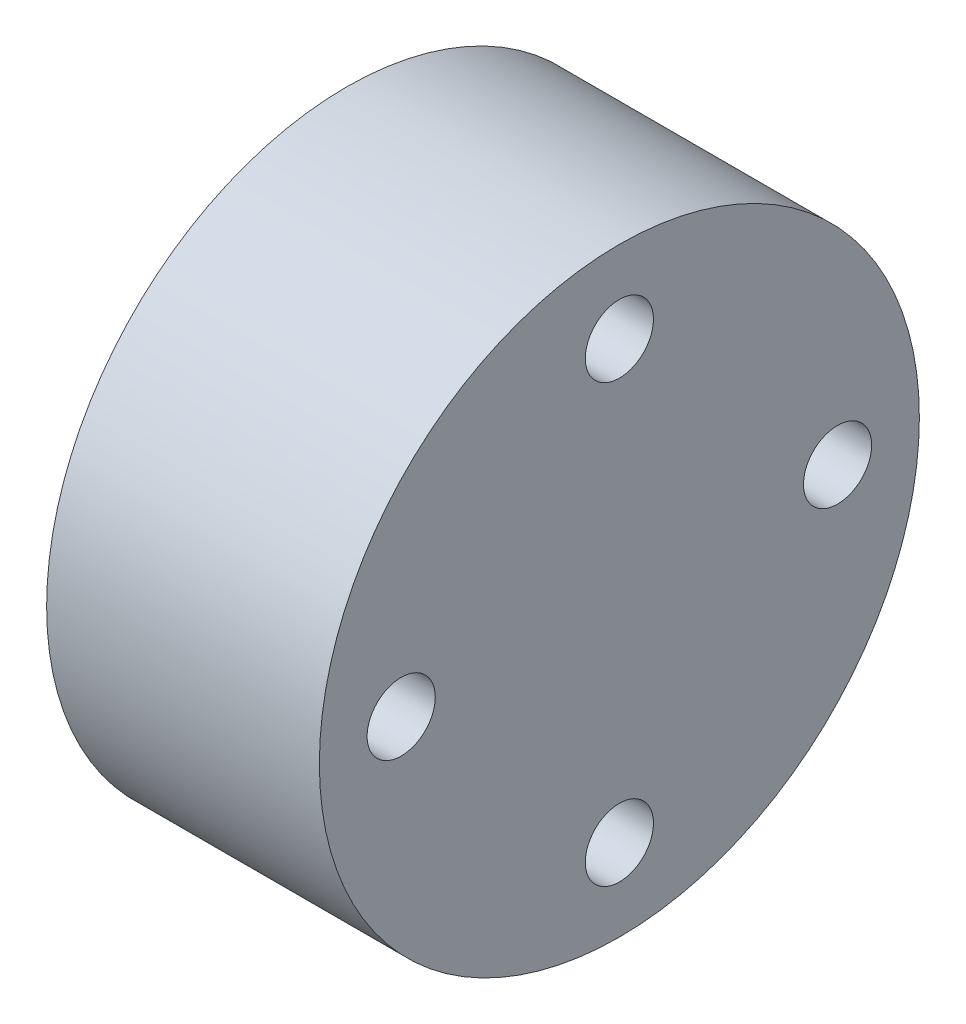
ISO-10303-21;
HEADER;
FILE_DESCRIPTION(('STEP AP214'),'2;1');
FILE_NAME('part.step','',(''),(''),'','','');
FILE_SCHEMA(('AUTOMOTIVE_DESIGN { 1 0 10303 214 1 1 1 1 }'));
ENDSEC;
DATA;
#1=APPLICATION_CONTEXT('core data for automotive mechanical design processes');
#2=APPLICATION_PROTOCOL_DEFINITION('international standard','automotive_design',2000,#1);
#3=PRODUCT_CONTEXT('',#1,'mechanical');
#4=PRODUCT('Part','Part','',(#3));
#5=PRODUCT_RELATED_PRODUCT_CATEGORY('part','',(#4));
#6=PRODUCT_DEFINITION_FORMATION('','',#4);
#7=PRODUCT_DEFINITION_CONTEXT('part definition',#1,'design');
#8=PRODUCT_DEFINITION('design','',#6,#7);
#9=PRODUCT_DEFINITION_SHAPE('','',#8);
#10=(LENGTH_UNIT() NAMED_UNIT(*) SI_UNIT(.MILLI.,.METRE.));
#11=(NAMED_UNIT(*) PLANE_ANGLE_UNIT() SI_UNIT($,.RADIAN.));
#12=(NAMED_UNIT(*) SI_UNIT($,.STERADIAN.) SOLID_ANGLE_UNIT());
#13=UNCERTAINTY_MEASURE_WITH_UNIT(LENGTH_MEASURE(1.E-05),#10,'distance_accuracy_value','');
#14=(GEOMETRIC_REPRESENTATION_CONTEXT(3) GLOBAL_UNCERTAINTY_ASSIGNED_CONTEXT((#13)) GLOBAL_UNIT_ASSIGNED_CONTEXT((#10,
#11,#12)) REPRESENTATION_CONTEXT('',''));
#15=CARTESIAN_POINT('',(0.,0.,0.));
#16=DIRECTION('',(0.,0.,1.));
#17=DIRECTION('',(1.,0.,0.));
#18=AXIS2_PLACEMENT_3D('',#15,#16,#17);
#19=CARTESIAN_POINT('',(10.,0.,0.));
#20=DIRECTION('',(-1.,0.,0.));
#21=DIRECTION('',(0.,0.,-1.));
#22=AXIS2_PLACEMENT_3D('',#19,#20,#21);
#23=CYLINDRICAL_SURFACE('',#22,11.);
#24=CARTESIAN_POINT('',(10.,0.,0.));
#25=DIRECTION('',(-1.,0.,0.));
#26=DIRECTION('',(0.,0.,1.));
#27=AXIS2_PLACEMENT_3D('',#24,#25,#26);
#28=CIRCLE('',#27,11.);
#29=CARTESIAN_POINT('',(10.,0.,11.));
#30=VERTEX_POINT('',#29);
#31=EDGE_CURVE('E10',#30,#30,#28,.T.);
#32=ORIENTED_EDGE('',*,*,#31,.T.);
#33=EDGE_LOOP('',(#32));
#34=FACE_BOUND('',#33,.T.);
#35=CARTESIAN_POINT('',(0.,0.,0.));
#36=DIRECTION('',(-1.,0.,0.));
#37=DIRECTION('',(0.,0.,1.));
#38=AXIS2_PLACEMENT_3D('',#35,#36,#37);
#39=CIRCLE('',#38,11.);
#40=CARTESIAN_POINT('',(0.,0.,11.));
#41=VERTEX_POINT('',#40);
#42=EDGE_CURVE('E38',#41,#41,#39,.T.);
#43=ORIENTED_EDGE('',*,*,#42,.F.);
#44=EDGE_LOOP('',(#43));
#45=FACE_BOUND('',#44,.T.);
#46=ADVANCED_FACE('F35',(#34,#45),#23,.T.);
#47=CARTESIAN_POINT('',(10.,0.,0.));
#48=DIRECTION('',(1.,0.,0.));
#49=DIRECTION('',(0.,0.,1.));
#50=AXIS2_PLACEMENT_3D('',#47,#48,#49);
#51=PLANE('',#50);
#52=CARTESIAN_POINT('',(10.,-4.54747350886464E-13,7.99999999999955));
#53=DIRECTION('',(1.,0.,0.));
#54=DIRECTION('',(0.,0.,-1.));
#55=AXIS2_PLACEMENT_3D('',#52,#53,#54);
#56=CIRCLE('',#55,1.25000000000065);
#57=CARTESIAN_POINT('',(10.,-4.54747350886464E-13,6.7499999999989));
#58=VERTEX_POINT('',#57);
#59=EDGE_CURVE('E62',#58,#58,#56,.T.);
#60=ORIENTED_EDGE('',*,*,#59,.F.);
#61=EDGE_LOOP('',(#60));
#62=FACE_BOUND('',#61,.T.);
#63=CARTESIAN_POINT('',(10.,-8.,-9.07535266894292E-13));
#64=DIRECTION('',(1.,0.,0.));
#65=DIRECTION('',(0.,0.,-1.));
#66=AXIS2_PLACEMENT_3D('',#63,#64,#65);
#67=CIRCLE('',#66,1.25000000000092);
#68=CARTESIAN_POINT('',(10.,-8.,-1.25000000000183));
#69=VERTEX_POINT('',#68);
#70=EDGE_CURVE('E56',#69,#69,#67,.T.);
#71=ORIENTED_EDGE('',*,*,#70,.F.);
#72=EDGE_LOOP('',(#71));
#73=FACE_BOUND('',#72,.T.);
#74=CARTESIAN_POINT('',(10.,4.53767633447146E-13,-8.00000000000045));
#75=DIRECTION('',(1.,0.,0.));
#76=DIRECTION('',(0.,0.,-1.));
#77=AXIS2_PLACEMENT_3D('',#74,#75,#76);
#78=CIRCLE('',#77,1.25000000000033);
#79=CARTESIAN_POINT('',(10.,4.53767633447146E-13,-9.25000000000078));
#80=VERTEX_POINT('',#79);
#81=EDGE_CURVE('E50',#80,#80,#78,.T.);
#82=ORIENTED_EDGE('',*,*,#81,.F.);
#83=EDGE_LOOP('',(#82));
#84=FACE_BOUND('',#83,.T.);
#85=CARTESIAN_POINT('',(10.,8.,0.));
#86=DIRECTION('',(1.,0.,0.));
#87=DIRECTION('',(0.,0.,-1.));
#88=AXIS2_PLACEMENT_3D('',#85,#86,#87);
#89=CIRCLE('',#88,1.25);
#90=CARTESIAN_POINT('',(10.,8.,-1.25));
#91=VERTEX_POINT('',#90);
#92=EDGE_CURVE('E45',#91,#91,#89,.T.);
#93=ORIENTED_EDGE('',*,*,#92,.F.);
#94=EDGE_LOOP('',(#93));
#95=FACE_BOUND('',#94,.T.);
#96=ORIENTED_EDGE('',*,*,#31,.F.);
#97=EDGE_LOOP('',(#96));
#98=FACE_BOUND('',#97,.T.);
#99=ADVANCED_FACE('F89',(#62,#73,#84,#95,#98),#51,.T.);
#100=CARTESIAN_POINT('',(0.,0.,0.));
#101=DIRECTION('',(1.,0.,0.));
#102=DIRECTION('',(0.,0.,1.));
#103=AXIS2_PLACEMENT_3D('',#100,#101,#102);
#104=PLANE('',#103);
#105=CARTESIAN_POINT('',(0.,0.,0.));
#106=DIRECTION('',(1.,0.,0.));
#107=DIRECTION('',(0.,0.,-1.));
#108=AXIS2_PLACEMENT_3D('',#105,#106,#107);
#109=CIRCLE('',#108,5.);
#110=CARTESIAN_POINT('',(0.,0.,-5.));
#111=VERTEX_POINT('',#110);
#112=EDGE_CURVE('E71',#111,#111,#109,.T.);
#113=ORIENTED_EDGE('',*,*,#112,.T.);
#114=EDGE_LOOP('',(#113));
#115=FACE_BOUND('',#114,.T.);
#116=CARTESIAN_POINT('',(0.,-4.54747350886464E-13,7.99999999999955));
#117=DIRECTION('',(1.,0.,0.));
#118=DIRECTION('',(0.,0.,-1.));
#119=AXIS2_PLACEMENT_3D('',#116,#117,#118);
#120=CIRCLE('',#119,1.25000000000065);
#121=CARTESIAN_POINT('',(0.,-4.54747350886464E-13,6.7499999999989));
#122=VERTEX_POINT('',#121);
#123=EDGE_CURVE('E65',#122,#122,#120,.T.);
#124=ORIENTED_EDGE('',*,*,#123,.T.);
#125=EDGE_LOOP('',(#124));
#126=FACE_BOUND('',#125,.T.);
#127=CARTESIAN_POINT('',(0.,-8.,-9.07535266894292E-13));
#128=DIRECTION('',(1.,0.,0.));
#129=DIRECTION('',(0.,0.,-1.));
#130=AXIS2_PLACEMENT_3D('',#127,#128,#129);
#131=CIRCLE('',#130,1.25000000000092);
#132=CARTESIAN_POINT('',(0.,-8.,-1.25000000000183));
#133=VERTEX_POINT('',#132);
#134=EDGE_CURVE('E59',#133,#133,#131,.T.);
#135=ORIENTED_EDGE('',*,*,#134,.T.);
#136=EDGE_LOOP('',(#135));
#137=FACE_BOUND('',#136,.T.);
#138=CARTESIAN_POINT('',(0.,4.53767633447146E-13,-8.00000000000045));
#139=DIRECTION('',(1.,0.,0.));
#140=DIRECTION('',(0.,0.,-1.));
#141=AXIS2_PLACEMENT_3D('',#138,#139,#140);
#142=CIRCLE('',#141,1.25000000000033);
#143=CARTESIAN_POINT('',(0.,4.53767633447146E-13,-9.25000000000078));
#144=VERTEX_POINT('',#143);
#145=EDGE_CURVE('E53',#144,#144,#142,.T.);
#146=ORIENTED_EDGE('',*,*,#145,.T.);
#147=EDGE_LOOP('',(#146));
#148=FACE_BOUND('',#147,.T.);
#149=CARTESIAN_POINT('',(0.,8.,0.));
#150=DIRECTION('',(1.,0.,0.));
#151=DIRECTION('',(0.,0.,-1.));
#152=AXIS2_PLACEMENT_3D('',#149,#150,#151);
#153=CIRCLE('',#152,1.25);
#154=CARTESIAN_POINT('',(0.,8.,-1.25));
#155=VERTEX_POINT('',#154);
#156=EDGE_CURVE('E47',#155,#155,#153,.T.);
#157=ORIENTED_EDGE('',*,*,#156,.T.);
#158=EDGE_LOOP('',(#157));
#159=FACE_BOUND('',#158,.T.);
#160=ORIENTED_EDGE('',*,*,#42,.T.);
#161=EDGE_LOOP('',(#160));
#162=FACE_BOUND('',#161,.T.);
#163=ADVANCED_FACE('F93',(#115,#126,#137,#148,#159,#162),#104,.F.);
#164=CARTESIAN_POINT('',(10.,8.,0.));
#165=DIRECTION('',(-1.,0.,0.));
#166=DIRECTION('',(0.,0.,-1.));
#167=AXIS2_PLACEMENT_3D('',#164,#165,#166);
#168=CYLINDRICAL_SURFACE('',#167,1.25);
#169=ORIENTED_EDGE('',*,*,#92,.T.);
#170=EDGE_LOOP('',(#169));
#171=FACE_BOUND('',#170,.T.);
#172=ORIENTED_EDGE('',*,*,#156,.F.);
#173=EDGE_LOOP('',(#172));
#174=FACE_BOUND('',#173,.T.);
#175=ADVANCED_FACE('F100',(#171,#174),#168,.F.);
#176=CARTESIAN_POINT('',(10.,4.53767633447146E-13,-8.00000000000045));
#177=DIRECTION('',(-1.,0.,0.));
#178=DIRECTION('',(0.,0.,-1.));
#179=AXIS2_PLACEMENT_3D('',#176,#177,#178);
#180=CYLINDRICAL_SURFACE('',#179,1.25000000000033);
#181=ORIENTED_EDGE('',*,*,#81,.T.);
#182=EDGE_LOOP('',(#181));
#183=FACE_BOUND('',#182,.T.);
#184=ORIENTED_EDGE('',*,*,#145,.F.);
#185=EDGE_LOOP('',(#184));
#186=FACE_BOUND('',#185,.T.);
#187=ADVANCED_FACE('F105',(#183,#186),#180,.F.);
#188=CARTESIAN_POINT('',(10.,-8.,-9.07535266894292E-13));
#189=DIRECTION('',(-1.,0.,0.));
#190=DIRECTION('',(0.,0.,-1.));
#191=AXIS2_PLACEMENT_3D('',#188,#189,#190);
#192=CYLINDRICAL_SURFACE('',#191,1.25000000000092);
#193=ORIENTED_EDGE('',*,*,#70,.T.);
#194=EDGE_LOOP('',(#193));
#195=FACE_BOUND('',#194,.T.);
#196=ORIENTED_EDGE('',*,*,#134,.F.);
#197=EDGE_LOOP('',(#196));
#198=FACE_BOUND('',#197,.T.);
#199=ADVANCED_FACE('F112',(#195,#198),#192,.F.);
#200=CARTESIAN_POINT('',(10.,-4.54747350886464E-13,7.99999999999955));
#201=DIRECTION('',(-1.,0.,0.));
#202=DIRECTION('',(0.,0.,-1.));
#203=AXIS2_PLACEMENT_3D('',#200,#201,#202);
#204=CYLINDRICAL_SURFACE('',#203,1.25000000000065);
#205=ORIENTED_EDGE('',*,*,#59,.T.);
#206=EDGE_LOOP('',(#205));
#207=FACE_BOUND('',#206,.T.);
#208=ORIENTED_EDGE('',*,*,#123,.F.);
#209=EDGE_LOOP('',(#208));
#210=FACE_BOUND('',#209,.T.);
#211=ADVANCED_FACE('F86',(#207,#210),#204,.F.);
#212=CARTESIAN_POINT('',(5.,0.,0.));
#213=DIRECTION('',(-1.,0.,0.));
#214=DIRECTION('',(0.,0.,-1.));
#215=AXIS2_PLACEMENT_3D('',#212,#213,#214);
#216=CYLINDRICAL_SURFACE('',#215,5.);
#217=CARTESIAN_POINT('',(5.,0.,0.));
#218=DIRECTION('',(1.,0.,0.));
#219=DIRECTION('',(0.,0.,-1.));
#220=AXIS2_PLACEMENT_3D('',#217,#218,#219);
#221=CIRCLE('',#220,5.);
#222=CARTESIAN_POINT('',(5.,0.,-5.));
#223=VERTEX_POINT('',#222);
#224=EDGE_CURVE('E68',#223,#223,#221,.T.);
#225=ORIENTED_EDGE('',*,*,#224,.T.);
#226=EDGE_LOOP('',(#225));
#227=FACE_BOUND('',#226,.T.);
#228=ORIENTED_EDGE('',*,*,#112,.F.);
#229=EDGE_LOOP('',(#228));
#230=FACE_BOUND('',#229,.T.);
#231=ADVANCED_FACE('F77',(#227,#230),#216,.F.);
#232=CARTESIAN_POINT('',(5.,0.,0.));
#233=DIRECTION('',(-1.,0.,0.));
#234=DIRECTION('',(0.,0.,-1.));
#235=AXIS2_PLACEMENT_3D('',#232,#233,#234);
#236=PLANE('',#235);
#237=ORIENTED_EDGE('',*,*,#224,.F.);
#238=EDGE_LOOP('',(#237));
#239=FACE_BOUND('',#238,.T.);
#240=ADVANCED_FACE('F80',(#239),#236,.T.);
#241=CLOSED_SHELL('',(#46,#99,#163,#175,#187,#199,#211,#231,#240));
#242=MANIFOLD_SOLID_BREP('B2',#241);
#243=ADVANCED_BREP_SHAPE_REPRESENTATION('',(#18,#242),#14);
#244=SHAPE_DEFINITION_REPRESENTATION(#9,#243);
ENDSEC;
END-ISO-10303-21;
